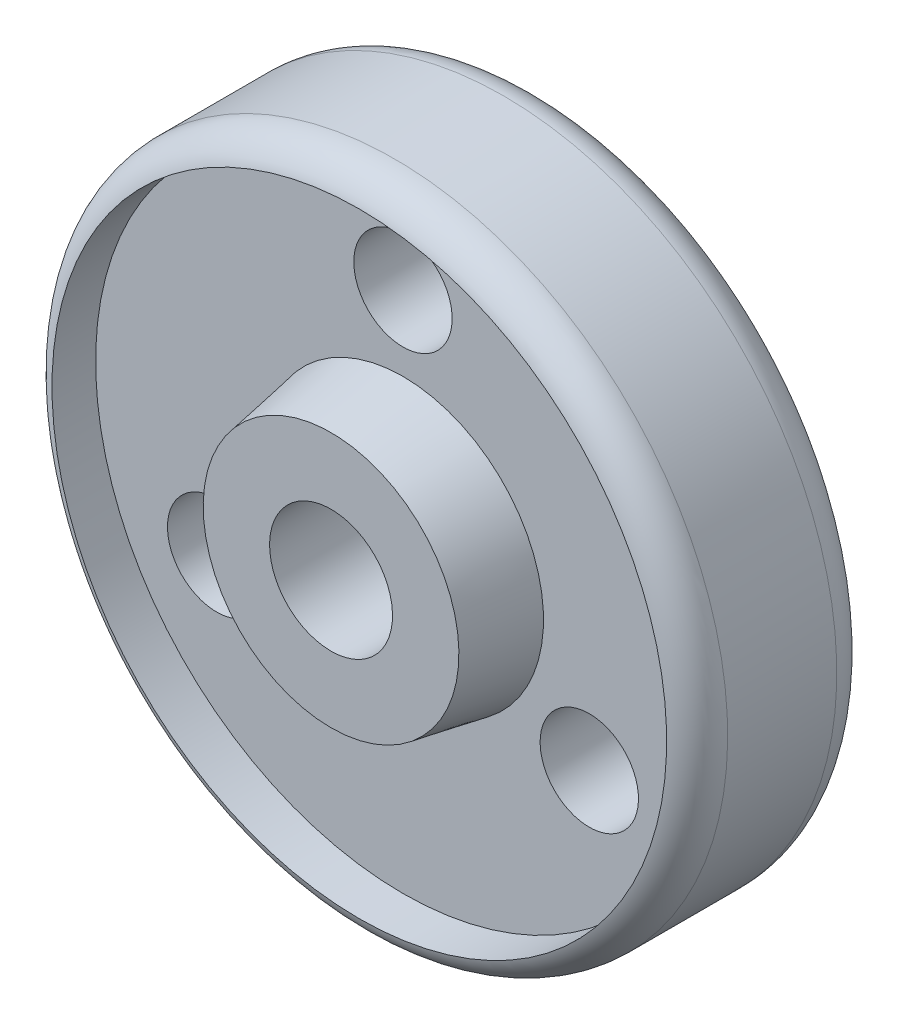
ISO-10303-21;
HEADER;
FILE_DESCRIPTION(('STEP AP214'),'2;1');
FILE_NAME('part.step','',(''),(''),'','','');
FILE_SCHEMA(('AUTOMOTIVE_DESIGN { 1 0 10303 214 1 1 1 1 }'));
ENDSEC;
DATA;
#1=APPLICATION_CONTEXT('core data for automotive mechanical design processes');
#2=APPLICATION_PROTOCOL_DEFINITION('international standard','automotive_design',2000,#1);
#3=PRODUCT_CONTEXT('',#1,'mechanical');
#4=PRODUCT('Part','Part','',(#3));
#5=PRODUCT_RELATED_PRODUCT_CATEGORY('part','',(#4));
#6=PRODUCT_DEFINITION_FORMATION('','',#4);
#7=PRODUCT_DEFINITION_CONTEXT('part definition',#1,'design');
#8=PRODUCT_DEFINITION('design','',#6,#7);
#9=PRODUCT_DEFINITION_SHAPE('','',#8);
#10=(LENGTH_UNIT() NAMED_UNIT(*) SI_UNIT(.MILLI.,.METRE.));
#11=(NAMED_UNIT(*) PLANE_ANGLE_UNIT() SI_UNIT($,.RADIAN.));
#12=(NAMED_UNIT(*) SI_UNIT($,.STERADIAN.) SOLID_ANGLE_UNIT());
#13=UNCERTAINTY_MEASURE_WITH_UNIT(LENGTH_MEASURE(1.E-05),#10,'distance_accuracy_value','');
#14=(GEOMETRIC_REPRESENTATION_CONTEXT(3) GLOBAL_UNCERTAINTY_ASSIGNED_CONTEXT((#13)) GLOBAL_UNIT_ASSIGNED_CONTEXT((#10,
#11,#12)) REPRESENTATION_CONTEXT('',''));
#15=CARTESIAN_POINT('',(0.,0.,0.));
#16=DIRECTION('',(0.,0.,1.));
#17=DIRECTION('',(1.,0.,0.));
#18=AXIS2_PLACEMENT_3D('',#15,#16,#17);
#19=CARTESIAN_POINT('',(0.,0.,0.));
#20=DIRECTION('',(0.,0.,1.));
#21=DIRECTION('',(0.,-1.,0.));
#22=AXIS2_PLACEMENT_3D('',#19,#20,#21);
#23=CYLINDRICAL_SURFACE('',#22,12.7);
#24=CARTESIAN_POINT('',(0.,0.,-24.384));
#25=DIRECTION('',(0.,0.,1.));
#26=DIRECTION('',(0.,-1.,0.));
#27=AXIS2_PLACEMENT_3D('',#24,#25,#26);
#28=CIRCLE('',#27,12.7);
#29=CARTESIAN_POINT('',(0.,-12.7,-24.384));
#30=VERTEX_POINT('',#29);
#31=EDGE_CURVE('E45',#30,#30,#28,.T.);
#32=ORIENTED_EDGE('',*,*,#31,.F.);
#33=EDGE_LOOP('',(#32));
#34=FACE_BOUND('',#33,.T.);
#35=CARTESIAN_POINT('',(0.,0.,24.384));
#36=DIRECTION('',(0.,0.,1.));
#37=DIRECTION('',(0.,-1.,0.));
#38=AXIS2_PLACEMENT_3D('',#35,#36,#37);
#39=CIRCLE('',#38,12.7);
#40=CARTESIAN_POINT('',(0.,-12.7,24.384));
#41=VERTEX_POINT('',#40);
#42=EDGE_CURVE('E87',#41,#41,#39,.T.);
#43=ORIENTED_EDGE('',*,*,#42,.T.);
#44=EDGE_LOOP('',(#43));
#45=FACE_BOUND('',#44,.T.);
#46=ADVANCED_FACE('F34',(#34,#45),#23,.F.);
#47=CARTESIAN_POINT('',(0.,12.7,-24.384));
#48=DIRECTION('',(0.,0.,1.));
#49=DIRECTION('',(0.,-1.,0.));
#50=AXIS2_PLACEMENT_3D('',#47,#48,#49);
#51=PLANE('',#50);
#52=CARTESIAN_POINT('',(0.,0.,-24.384));
#53=DIRECTION('',(0.,0.,1.));
#54=DIRECTION('',(0.,-1.,0.));
#55=AXIS2_PLACEMENT_3D('',#52,#53,#54);
#56=CIRCLE('',#55,26.416);
#57=CARTESIAN_POINT('',(0.,-26.416,-24.384));
#58=VERTEX_POINT('',#57);
#59=EDGE_CURVE('E49',#58,#58,#56,.T.);
#60=ORIENTED_EDGE('',*,*,#59,.F.);
#61=EDGE_LOOP('',(#60));
#62=FACE_BOUND('',#61,.T.);
#63=ORIENTED_EDGE('',*,*,#31,.T.);
#64=EDGE_LOOP('',(#63));
#65=FACE_BOUND('',#64,.T.);
#66=ADVANCED_FACE('F114',(#62,#65),#51,.F.);
#67=CARTESIAN_POINT('',(0.,0.,-24.384));
#68=DIRECTION('',(0.,0.,1.));
#69=DIRECTION('',(0.,-1.,0.));
#70=AXIS2_PLACEMENT_3D('',#67,#68,#69);
#71=CONICAL_SURFACE('',#70,26.416,0.174532925199426);
#72=CARTESIAN_POINT('',(0.,0.,-9.525));
#73=DIRECTION('',(0.,0.,1.));
#74=DIRECTION('',(0.,-1.,0.));
#75=AXIS2_PLACEMENT_3D('',#72,#73,#74);
#76=CIRCLE('',#75,29.036042606347);
#77=CARTESIAN_POINT('',(0.,-29.036042606347,-9.525));
#78=VERTEX_POINT('',#77);
#79=EDGE_CURVE('E66',#78,#78,#76,.T.);
#80=ORIENTED_EDGE('',*,*,#79,.F.);
#81=EDGE_LOOP('',(#80));
#82=FACE_BOUND('',#81,.T.);
#83=ORIENTED_EDGE('',*,*,#59,.T.);
#84=EDGE_LOOP('',(#83));
#85=FACE_BOUND('',#84,.T.);
#86=ADVANCED_FACE('F103',(#82,#85),#71,.T.);
#87=CARTESIAN_POINT('',(0.,29.036042606347,-9.525));
#88=DIRECTION('',(0.,0.,1.));
#89=DIRECTION('',(0.,-1.,0.));
#90=AXIS2_PLACEMENT_3D('',#87,#88,#89);
#91=PLANE('',#90);
#92=CARTESIAN_POINT('',(-38.4948291982182,-22.2250000000002,-9.52500000000001));
#93=DIRECTION('',(0.,0.,1.));
#94=DIRECTION('',(0.,-1.,0.));
#95=AXIS2_PLACEMENT_3D('',#92,#93,#94);
#96=CIRCLE('',#95,10.16);
#97=CARTESIAN_POINT('',(-38.4948291982182,-32.3850000000002,-9.52500000000001));
#98=VERTEX_POINT('',#97);
#99=EDGE_CURVE('E55',#98,#98,#96,.F.);
#100=ORIENTED_EDGE('',*,*,#99,.F.);
#101=EDGE_LOOP('',(#100));
#102=FACE_BOUND('',#101,.T.);
#103=CARTESIAN_POINT('',(38.4948291982185,-22.2249999999996,-9.52500000000001));
#104=DIRECTION('',(0.,0.,1.));
#105=DIRECTION('',(0.,-1.,0.));
#106=AXIS2_PLACEMENT_3D('',#103,#104,#105);
#107=CIRCLE('',#106,10.16);
#108=CARTESIAN_POINT('',(38.4948291982185,-32.3849999999996,-9.52500000000001));
#109=VERTEX_POINT('',#108);
#110=EDGE_CURVE('E56',#109,#109,#107,.F.);
#111=ORIENTED_EDGE('',*,*,#110,.F.);
#112=EDGE_LOOP('',(#111));
#113=FACE_BOUND('',#112,.T.);
#114=CARTESIAN_POINT('',(0.,44.45,-9.52500000000001));
#115=DIRECTION('',(0.,0.,1.));
#116=DIRECTION('',(0.,-1.,0.));
#117=AXIS2_PLACEMENT_3D('',#114,#115,#116);
#118=CIRCLE('',#117,10.16);
#119=CARTESIAN_POINT('',(0.,34.29,-9.52500000000001));
#120=VERTEX_POINT('',#119);
#121=EDGE_CURVE('E62',#120,#120,#118,.F.);
#122=ORIENTED_EDGE('',*,*,#121,.F.);
#123=EDGE_LOOP('',(#122));
#124=FACE_BOUND('',#123,.T.);
#125=CARTESIAN_POINT('',(0.,0.,-9.525));
#126=DIRECTION('',(0.,0.,1.));
#127=DIRECTION('',(0.,-1.,0.));
#128=AXIS2_PLACEMENT_3D('',#125,#126,#127);
#129=CIRCLE('',#128,63.5);
#130=CARTESIAN_POINT('',(0.,-63.5,-9.525));
#131=VERTEX_POINT('',#130);
#132=EDGE_CURVE('E69',#131,#131,#129,.T.);
#133=ORIENTED_EDGE('',*,*,#132,.F.);
#134=EDGE_LOOP('',(#133));
#135=FACE_BOUND('',#134,.T.);
#136=ORIENTED_EDGE('',*,*,#79,.T.);
#137=EDGE_LOOP('',(#136));
#138=FACE_BOUND('',#137,.T.);
#139=ADVANCED_FACE('F99',(#102,#113,#124,#135,#138),#91,.F.);
#140=CARTESIAN_POINT('',(0.,0.,0.));
#141=DIRECTION('',(0.,0.,1.));
#142=DIRECTION('',(0.,-1.,0.));
#143=AXIS2_PLACEMENT_3D('',#140,#141,#142);
#144=CYLINDRICAL_SURFACE('',#143,63.5);
#145=CARTESIAN_POINT('',(0.,0.,-18.542));
#146=DIRECTION('',(0.,0.,1.));
#147=DIRECTION('',(0.,-1.,0.));
#148=AXIS2_PLACEMENT_3D('',#145,#146,#147);
#149=CIRCLE('',#148,63.5);
#150=CARTESIAN_POINT('',(0.,-63.5,-18.542));
#151=VERTEX_POINT('',#150);
#152=EDGE_CURVE('E72',#151,#151,#149,.T.);
#153=ORIENTED_EDGE('',*,*,#152,.F.);
#154=EDGE_LOOP('',(#153));
#155=FACE_BOUND('',#154,.T.);
#156=ORIENTED_EDGE('',*,*,#132,.T.);
#157=EDGE_LOOP('',(#156));
#158=FACE_BOUND('',#157,.T.);
#159=ADVANCED_FACE('F102',(#155,#158),#144,.F.);
#160=CARTESIAN_POINT('',(0.,0.,0.));
#161=DIRECTION('',(0.,0.,1.));
#162=DIRECTION('',(0.,-1.,0.));
#163=AXIS2_PLACEMENT_3D('',#160,#161,#162);
#164=CYLINDRICAL_SURFACE('',#163,68.834);
#165=CARTESIAN_POINT('',(0.,0.,-11.2729832852029));
#166=DIRECTION('',(0.,0.,-1.));
#167=DIRECTION('',(0.,1.,0.));
#168=AXIS2_PLACEMENT_3D('',#165,#166,#167);
#169=CIRCLE('',#168,68.834);
#170=CARTESIAN_POINT('',(0.,68.834,-11.2729832852029));
#171=VERTEX_POINT('',#170);
#172=EDGE_CURVE('E10',#171,#171,#169,.F.);
#173=ORIENTED_EDGE('',*,*,#172,.T.);
#174=EDGE_LOOP('',(#173));
#175=FACE_BOUND('',#174,.T.);
#176=CARTESIAN_POINT('',(0.,0.,11.2729832852029));
#177=DIRECTION('',(0.,0.,1.));
#178=DIRECTION('',(0.,-1.,0.));
#179=AXIS2_PLACEMENT_3D('',#176,#177,#178);
#180=CIRCLE('',#179,68.834);
#181=CARTESIAN_POINT('',(0.,-68.834,11.2729832852029));
#182=VERTEX_POINT('',#181);
#183=EDGE_CURVE('E41',#182,#182,#180,.F.);
#184=ORIENTED_EDGE('',*,*,#183,.T.);
#185=EDGE_LOOP('',(#184));
#186=FACE_BOUND('',#185,.T.);
#187=ADVANCED_FACE('F151',(#175,#186),#164,.T.);
#188=CARTESIAN_POINT('',(0.,0.,0.));
#189=DIRECTION('',(0.,0.,1.));
#190=DIRECTION('',(0.,-1.,0.));
#191=AXIS2_PLACEMENT_3D('',#188,#189,#190);
#192=CYLINDRICAL_SURFACE('',#191,63.5);
#193=CARTESIAN_POINT('',(0.,0.,9.525));
#194=DIRECTION('',(0.,0.,1.));
#195=DIRECTION('',(0.,-1.,0.));
#196=AXIS2_PLACEMENT_3D('',#193,#194,#195);
#197=CIRCLE('',#196,63.5);
#198=CARTESIAN_POINT('',(0.,-63.5,9.525));
#199=VERTEX_POINT('',#198);
#200=EDGE_CURVE('E78',#199,#199,#197,.T.);
#201=ORIENTED_EDGE('',*,*,#200,.F.);
#202=EDGE_LOOP('',(#201));
#203=FACE_BOUND('',#202,.T.);
#204=CARTESIAN_POINT('',(0.,0.,18.542));
#205=DIRECTION('',(0.,0.,1.));
#206=DIRECTION('',(0.,-1.,0.));
#207=AXIS2_PLACEMENT_3D('',#204,#205,#206);
#208=CIRCLE('',#207,63.5);
#209=CARTESIAN_POINT('',(0.,-63.5,18.542));
#210=VERTEX_POINT('',#209);
#211=EDGE_CURVE('E75',#210,#210,#208,.T.);
#212=ORIENTED_EDGE('',*,*,#211,.T.);
#213=EDGE_LOOP('',(#212));
#214=FACE_BOUND('',#213,.T.);
#215=ADVANCED_FACE('F144',(#203,#214),#192,.F.);
#216=CARTESIAN_POINT('',(0.,29.036042606347,9.525));
#217=DIRECTION('',(0.,0.,-1.));
#218=DIRECTION('',(0.,1.,0.));
#219=AXIS2_PLACEMENT_3D('',#216,#217,#218);
#220=PLANE('',#219);
#221=CARTESIAN_POINT('',(-38.4948291982182,-22.2250000000002,9.52500000000001));
#222=DIRECTION('',(0.,0.,-1.));
#223=DIRECTION('',(0.,1.,0.));
#224=AXIS2_PLACEMENT_3D('',#221,#222,#223);
#225=CIRCLE('',#224,10.16);
#226=CARTESIAN_POINT('',(-38.4948291982182,-12.0650000000002,9.52500000000001));
#227=VERTEX_POINT('',#226);
#228=EDGE_CURVE('E52',#227,#227,#225,.F.);
#229=ORIENTED_EDGE('',*,*,#228,.F.);
#230=EDGE_LOOP('',(#229));
#231=FACE_BOUND('',#230,.T.);
#232=CARTESIAN_POINT('',(38.4948291982185,-22.2249999999996,9.52500000000001));
#233=DIRECTION('',(0.,0.,-1.));
#234=DIRECTION('',(0.,1.,0.));
#235=AXIS2_PLACEMENT_3D('',#232,#233,#234);
#236=CIRCLE('',#235,10.16);
#237=CARTESIAN_POINT('',(38.4948291982185,-12.0649999999996,9.52500000000001));
#238=VERTEX_POINT('',#237);
#239=EDGE_CURVE('E57',#238,#238,#236,.F.);
#240=ORIENTED_EDGE('',*,*,#239,.F.);
#241=EDGE_LOOP('',(#240));
#242=FACE_BOUND('',#241,.T.);
#243=CARTESIAN_POINT('',(0.,44.45,9.52500000000001));
#244=DIRECTION('',(0.,0.,-1.));
#245=DIRECTION('',(0.,1.,0.));
#246=AXIS2_PLACEMENT_3D('',#243,#244,#245);
#247=CIRCLE('',#246,10.16);
#248=CARTESIAN_POINT('',(0.,54.61,9.52500000000001));
#249=VERTEX_POINT('',#248);
#250=EDGE_CURVE('E60',#249,#249,#247,.F.);
#251=ORIENTED_EDGE('',*,*,#250,.F.);
#252=EDGE_LOOP('',(#251));
#253=FACE_BOUND('',#252,.T.);
#254=CARTESIAN_POINT('',(0.,0.,9.525));
#255=DIRECTION('',(0.,0.,1.));
#256=DIRECTION('',(0.,-1.,0.));
#257=AXIS2_PLACEMENT_3D('',#254,#255,#256);
#258=CIRCLE('',#257,29.036042606347);
#259=CARTESIAN_POINT('',(0.,-29.036042606347,9.525));
#260=VERTEX_POINT('',#259);
#261=EDGE_CURVE('E81',#260,#260,#258,.T.);
#262=ORIENTED_EDGE('',*,*,#261,.F.);
#263=EDGE_LOOP('',(#262));
#264=FACE_BOUND('',#263,.T.);
#265=ORIENTED_EDGE('',*,*,#200,.T.);
#266=EDGE_LOOP('',(#265));
#267=FACE_BOUND('',#266,.T.);
#268=ADVANCED_FACE('F138',(#231,#242,#253,#264,#267),#220,.F.);
#269=CARTESIAN_POINT('',(0.,0.,9.525));
#270=DIRECTION('',(0.,0.,-1.));
#271=DIRECTION('',(0.,1.,0.));
#272=AXIS2_PLACEMENT_3D('',#269,#270,#271);
#273=CONICAL_SURFACE('',#272,29.036042606347,0.174532925199426);
#274=CARTESIAN_POINT('',(0.,0.,24.384));
#275=DIRECTION('',(0.,0.,1.));
#276=DIRECTION('',(0.,-1.,0.));
#277=AXIS2_PLACEMENT_3D('',#274,#275,#276);
#278=CIRCLE('',#277,26.416);
#279=CARTESIAN_POINT('',(0.,-26.416,24.384));
#280=VERTEX_POINT('',#279);
#281=EDGE_CURVE('E84',#280,#280,#278,.T.);
#282=ORIENTED_EDGE('',*,*,#281,.F.);
#283=EDGE_LOOP('',(#282));
#284=FACE_BOUND('',#283,.T.);
#285=ORIENTED_EDGE('',*,*,#261,.T.);
#286=EDGE_LOOP('',(#285));
#287=FACE_BOUND('',#286,.T.);
#288=ADVANCED_FACE('F132',(#284,#287),#273,.T.);
#289=CARTESIAN_POINT('',(0.,12.7,24.384));
#290=DIRECTION('',(0.,0.,-1.));
#291=DIRECTION('',(0.,1.,0.));
#292=AXIS2_PLACEMENT_3D('',#289,#290,#291);
#293=PLANE('',#292);
#294=ORIENTED_EDGE('',*,*,#42,.F.);
#295=EDGE_LOOP('',(#294));
#296=FACE_BOUND('',#295,.T.);
#297=ORIENTED_EDGE('',*,*,#281,.T.);
#298=EDGE_LOOP('',(#297));
#299=FACE_BOUND('',#298,.T.);
#300=ADVANCED_FACE('F128',(#296,#299),#293,.F.);
#301=CARTESIAN_POINT('',(0.,44.45,254.));
#302=DIRECTION('',(0.,0.,-1.));
#303=DIRECTION('',(-1.,0.,0.));
#304=AXIS2_PLACEMENT_3D('',#301,#302,#303);
#305=CYLINDRICAL_SURFACE('',#304,10.16);
#306=ORIENTED_EDGE('',*,*,#250,.T.);
#307=EDGE_LOOP('',(#306));
#308=FACE_BOUND('',#307,.T.);
#309=ORIENTED_EDGE('',*,*,#121,.T.);
#310=EDGE_LOOP('',(#309));
#311=FACE_BOUND('',#310,.T.);
#312=ADVANCED_FACE('F131',(#308,#311),#305,.F.);
#313=CARTESIAN_POINT('',(38.4948291982185,-22.2249999999996,254.));
#314=DIRECTION('',(0.,0.,-1.));
#315=DIRECTION('',(0.,1.,0.));
#316=AXIS2_PLACEMENT_3D('',#313,#314,#315);
#317=CYLINDRICAL_SURFACE('',#316,10.16);
#318=ORIENTED_EDGE('',*,*,#239,.T.);
#319=EDGE_LOOP('',(#318));
#320=FACE_BOUND('',#319,.T.);
#321=ORIENTED_EDGE('',*,*,#110,.T.);
#322=EDGE_LOOP('',(#321));
#323=FACE_BOUND('',#322,.T.);
#324=ADVANCED_FACE('F97',(#320,#323),#317,.F.);
#325=CARTESIAN_POINT('',(-38.4948291982182,-22.2250000000002,254.));
#326=DIRECTION('',(0.,0.,-1.));
#327=DIRECTION('',(0.,1.,0.));
#328=AXIS2_PLACEMENT_3D('',#325,#326,#327);
#329=CYLINDRICAL_SURFACE('',#328,10.16);
#330=ORIENTED_EDGE('',*,*,#228,.T.);
#331=EDGE_LOOP('',(#330));
#332=FACE_BOUND('',#331,.T.);
#333=ORIENTED_EDGE('',*,*,#99,.T.);
#334=EDGE_LOOP('',(#333));
#335=FACE_BOUND('',#334,.T.);
#336=ADVANCED_FACE('F161',(#332,#335),#329,.F.);
#337=CARTESIAN_POINT('',(0.,0.,-11.2729832852029));
#338=DIRECTION('',(0.,0.,-1.));
#339=DIRECTION('',(0.,1.,0.));
#340=AXIS2_PLACEMENT_3D('',#337,#338,#339);
#341=TOROIDAL_SURFACE('',#340,61.214,7.62);
#342=ORIENTED_EDGE('',*,*,#152,.T.);
#343=EDGE_LOOP('',(#342));
#344=FACE_BOUND('',#343,.T.);
#345=ORIENTED_EDGE('',*,*,#172,.F.);
#346=EDGE_LOOP('',(#345));
#347=FACE_BOUND('',#346,.T.);
#348=ADVANCED_FACE('F156',(#344,#347),#341,.T.);
#349=CARTESIAN_POINT('',(0.,0.,11.2729832852029));
#350=DIRECTION('',(0.,0.,1.));
#351=DIRECTION('',(0.,-1.,0.));
#352=AXIS2_PLACEMENT_3D('',#349,#350,#351);
#353=TOROIDAL_SURFACE('',#352,61.214,7.62);
#354=ORIENTED_EDGE('',*,*,#183,.F.);
#355=EDGE_LOOP('',(#354));
#356=FACE_BOUND('',#355,.T.);
#357=ORIENTED_EDGE('',*,*,#211,.F.);
#358=EDGE_LOOP('',(#357));
#359=FACE_BOUND('',#358,.T.);
#360=ADVANCED_FACE('F36',(#356,#359),#353,.T.);
#361=CLOSED_SHELL('',(#46,#66,#86,#139,#159,#187,#215,#268,#288,#300,#312,#324,#336,#348,#360));
#362=MANIFOLD_SOLID_BREP('B2',#361);
#363=ADVANCED_BREP_SHAPE_REPRESENTATION('',(#18,#362),#14);
#364=SHAPE_DEFINITION_REPRESENTATION(#9,#363);
ENDSEC;
END-ISO-10303-21;
